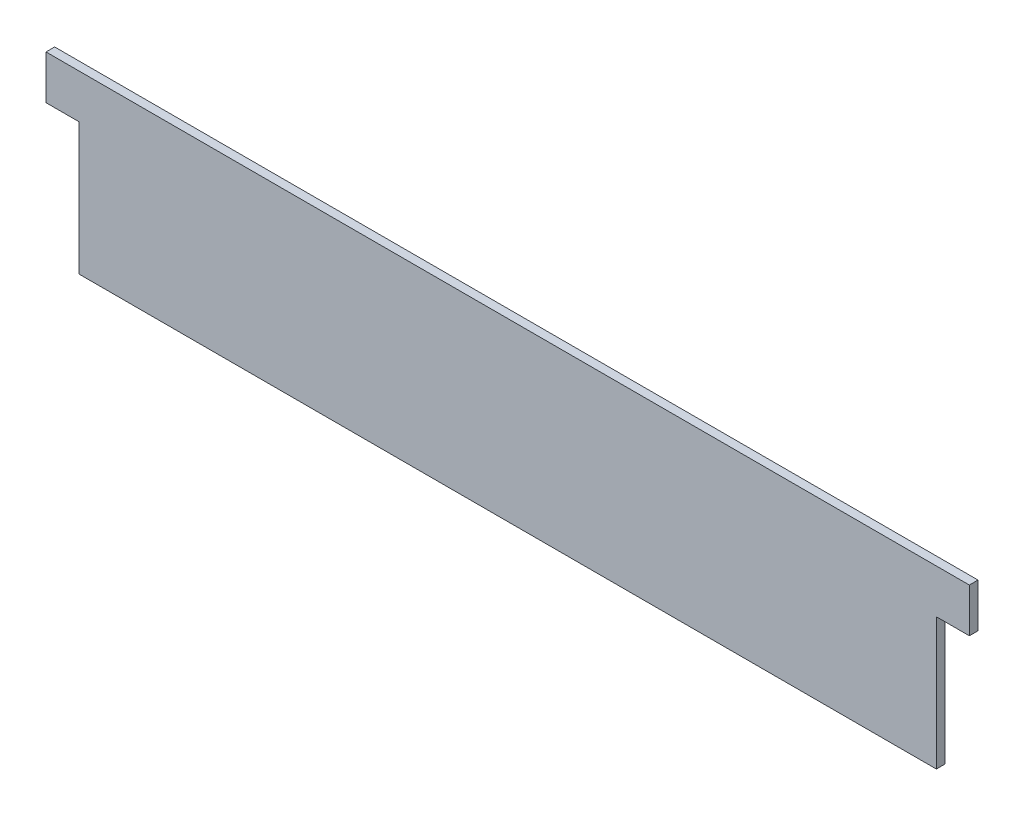
ISO-10303-21;
HEADER;
FILE_DESCRIPTION(('STEP AP214'),'2;1');
FILE_NAME('part.step','',(''),(''),'','','');
FILE_SCHEMA(('AUTOMOTIVE_DESIGN { 1 0 10303 214 1 1 1 1 }'));
ENDSEC;
DATA;
#1=APPLICATION_CONTEXT('core data for automotive mechanical design processes');
#2=APPLICATION_PROTOCOL_DEFINITION('international standard','automotive_design',2000,#1);
#3=PRODUCT_CONTEXT('',#1,'mechanical');
#4=PRODUCT('Part','Part','',(#3));
#5=PRODUCT_RELATED_PRODUCT_CATEGORY('part','',(#4));
#6=PRODUCT_DEFINITION_FORMATION('','',#4);
#7=PRODUCT_DEFINITION_CONTEXT('part definition',#1,'design');
#8=PRODUCT_DEFINITION('design','',#6,#7);
#9=PRODUCT_DEFINITION_SHAPE('','',#8);
#10=(LENGTH_UNIT() NAMED_UNIT(*) SI_UNIT(.MILLI.,.METRE.));
#11=(NAMED_UNIT(*) PLANE_ANGLE_UNIT() SI_UNIT($,.RADIAN.));
#12=(NAMED_UNIT(*) SI_UNIT($,.STERADIAN.) SOLID_ANGLE_UNIT());
#13=UNCERTAINTY_MEASURE_WITH_UNIT(LENGTH_MEASURE(1.E-05),#10,'distance_accuracy_value','');
#14=(GEOMETRIC_REPRESENTATION_CONTEXT(3) GLOBAL_UNCERTAINTY_ASSIGNED_CONTEXT((#13)) GLOBAL_UNIT_ASSIGNED_CONTEXT((#10,
#11,#12)) REPRESENTATION_CONTEXT('',''));
#15=CARTESIAN_POINT('',(0.,0.,0.));
#16=DIRECTION('',(0.,0.,1.));
#17=DIRECTION('',(1.,0.,0.));
#18=AXIS2_PLACEMENT_3D('',#15,#16,#17);
#19=CARTESIAN_POINT('',(-266.7,38.1000000000001,2.5));
#20=DIRECTION('',(1.,0.,0.));
#21=DIRECTION('',(0.,0.,-1.));
#22=AXIS2_PLACEMENT_3D('',#19,#20,#21);
#23=PLANE('',#22);
#24=DIRECTION('',(0.,-1.,0.));
#25=VECTOR('',#24,1.);
#26=CARTESIAN_POINT('',(-266.7,38.1000000000001,-2.5));
#27=LINE('',#26,#25);
#28=CARTESIAN_POINT('',(-266.7,63.5000000000001,-2.5));
#29=VERTEX_POINT('',#28);
#30=CARTESIAN_POINT('',(-266.7,38.1000000000001,-2.5));
#31=VERTEX_POINT('',#30);
#32=EDGE_CURVE('E129',#29,#31,#27,.T.);
#33=ORIENTED_EDGE('',*,*,#32,.T.);
#34=DIRECTION('',(0.,0.,-1.));
#35=VECTOR('',#34,1.);
#36=CARTESIAN_POINT('',(-266.7,38.1000000000001,2.5));
#37=LINE('',#36,#35);
#38=CARTESIAN_POINT('',(-266.7,38.1000000000001,2.5));
#39=VERTEX_POINT('',#38);
#40=EDGE_CURVE('E11',#39,#31,#37,.T.);
#41=ORIENTED_EDGE('',*,*,#40,.F.);
#42=DIRECTION('',(0.,-1.,0.));
#43=VECTOR('',#42,1.);
#44=CARTESIAN_POINT('',(-266.7,38.1000000000001,2.5));
#45=LINE('',#44,#43);
#46=CARTESIAN_POINT('',(-266.7,63.5000000000001,2.5));
#47=VERTEX_POINT('',#46);
#48=EDGE_CURVE('E143',#47,#39,#45,.T.);
#49=ORIENTED_EDGE('',*,*,#48,.F.);
#50=DIRECTION('',(0.,0.,-1.));
#51=VECTOR('',#50,1.);
#52=CARTESIAN_POINT('',(-266.7,63.5000000000001,2.5));
#53=LINE('',#52,#51);
#54=EDGE_CURVE('E125',#47,#29,#53,.T.);
#55=ORIENTED_EDGE('',*,*,#54,.T.);
#56=EDGE_LOOP('',(#33,#41,#49,#55));
#57=FACE_BOUND('',#56,.T.);
#58=ADVANCED_FACE('F33',(#57),#23,.F.);
#59=CARTESIAN_POINT('',(-247.65,38.1,2.5));
#60=DIRECTION('',(0.,1.,0.));
#61=DIRECTION('',(-1.,0.,0.));
#62=AXIS2_PLACEMENT_3D('',#59,#60,#61);
#63=PLANE('',#62);
#64=DIRECTION('',(1.,0.,0.));
#65=VECTOR('',#64,1.);
#66=CARTESIAN_POINT('',(-247.65,38.1,-2.5));
#67=LINE('',#66,#65);
#68=CARTESIAN_POINT('',(-247.65,38.1,-2.5));
#69=VERTEX_POINT('',#68);
#70=EDGE_CURVE('E132',#31,#69,#67,.T.);
#71=ORIENTED_EDGE('',*,*,#70,.T.);
#72=DIRECTION('',(0.,0.,-1.));
#73=VECTOR('',#72,1.);
#74=CARTESIAN_POINT('',(-247.65,38.1,2.5));
#75=LINE('',#74,#73);
#76=CARTESIAN_POINT('',(-247.65,38.1,2.5));
#77=VERTEX_POINT('',#76);
#78=EDGE_CURVE('E41',#77,#69,#75,.T.);
#79=ORIENTED_EDGE('',*,*,#78,.F.);
#80=DIRECTION('',(1.,0.,0.));
#81=VECTOR('',#80,1.);
#82=CARTESIAN_POINT('',(-247.65,38.1,2.5));
#83=LINE('',#82,#81);
#84=EDGE_CURVE('E92',#39,#77,#83,.T.);
#85=ORIENTED_EDGE('',*,*,#84,.F.);
#86=ORIENTED_EDGE('',*,*,#40,.T.);
#87=EDGE_LOOP('',(#71,#79,#85,#86));
#88=FACE_BOUND('',#87,.T.);
#89=ADVANCED_FACE('F178',(#88),#63,.F.);
#90=CARTESIAN_POINT('',(-247.65,-38.1,2.5));
#91=DIRECTION('',(1.,0.,0.));
#92=DIRECTION('',(0.,0.,-1.));
#93=AXIS2_PLACEMENT_3D('',#90,#91,#92);
#94=PLANE('',#93);
#95=DIRECTION('',(0.,-1.,0.));
#96=VECTOR('',#95,1.);
#97=CARTESIAN_POINT('',(-247.65,-38.1,-2.5));
#98=LINE('',#97,#96);
#99=CARTESIAN_POINT('',(-247.65,-38.1,-2.5));
#100=VERTEX_POINT('',#99);
#101=EDGE_CURVE('E134',#69,#100,#98,.T.);
#102=ORIENTED_EDGE('',*,*,#101,.T.);
#103=DIRECTION('',(0.,0.,-1.));
#104=VECTOR('',#103,1.);
#105=CARTESIAN_POINT('',(-247.65,-38.1,2.5));
#106=LINE('',#105,#104);
#107=CARTESIAN_POINT('',(-247.65,-38.1,2.5));
#108=VERTEX_POINT('',#107);
#109=EDGE_CURVE('E150',#108,#100,#106,.T.);
#110=ORIENTED_EDGE('',*,*,#109,.F.);
#111=DIRECTION('',(0.,-1.,0.));
#112=VECTOR('',#111,1.);
#113=CARTESIAN_POINT('',(-247.65,-38.1,2.5));
#114=LINE('',#113,#112);
#115=EDGE_CURVE('E158',#77,#108,#114,.T.);
#116=ORIENTED_EDGE('',*,*,#115,.F.);
#117=ORIENTED_EDGE('',*,*,#78,.T.);
#118=EDGE_LOOP('',(#102,#110,#116,#117));
#119=FACE_BOUND('',#118,.T.);
#120=ADVANCED_FACE('F156',(#119),#94,.F.);
#121=CARTESIAN_POINT('',(247.65,-38.1,2.5));
#122=DIRECTION('',(0.,1.,0.));
#123=DIRECTION('',(0.,0.,1.));
#124=AXIS2_PLACEMENT_3D('',#121,#122,#123);
#125=PLANE('',#124);
#126=DIRECTION('',(1.,0.,0.));
#127=VECTOR('',#126,1.);
#128=CARTESIAN_POINT('',(247.65,-38.1,-2.5));
#129=LINE('',#128,#127);
#130=CARTESIAN_POINT('',(247.65,-38.1,-2.5));
#131=VERTEX_POINT('',#130);
#132=EDGE_CURVE('E136',#100,#131,#129,.T.);
#133=ORIENTED_EDGE('',*,*,#132,.T.);
#134=DIRECTION('',(0.,0.,-1.));
#135=VECTOR('',#134,1.);
#136=CARTESIAN_POINT('',(247.65,-38.1,2.5));
#137=LINE('',#136,#135);
#138=CARTESIAN_POINT('',(247.65,-38.1,2.5));
#139=VERTEX_POINT('',#138);
#140=EDGE_CURVE('E147',#139,#131,#137,.T.);
#141=ORIENTED_EDGE('',*,*,#140,.F.);
#142=DIRECTION('',(1.,0.,0.));
#143=VECTOR('',#142,1.);
#144=CARTESIAN_POINT('',(247.65,-38.1,2.5));
#145=LINE('',#144,#143);
#146=EDGE_CURVE('E170',#108,#139,#145,.T.);
#147=ORIENTED_EDGE('',*,*,#146,.F.);
#148=ORIENTED_EDGE('',*,*,#109,.T.);
#149=EDGE_LOOP('',(#133,#141,#147,#148));
#150=FACE_BOUND('',#149,.T.);
#151=ADVANCED_FACE('F166',(#150),#125,.F.);
#152=CARTESIAN_POINT('',(247.65,38.1,2.5));
#153=DIRECTION('',(-1.,0.,0.));
#154=DIRECTION('',(0.,0.,1.));
#155=AXIS2_PLACEMENT_3D('',#152,#153,#154);
#156=PLANE('',#155);
#157=DIRECTION('',(0.,1.,0.));
#158=VECTOR('',#157,1.);
#159=CARTESIAN_POINT('',(247.65,38.1,-2.5));
#160=LINE('',#159,#158);
#161=CARTESIAN_POINT('',(247.65,38.1,-2.5));
#162=VERTEX_POINT('',#161);
#163=EDGE_CURVE('E138',#131,#162,#160,.T.);
#164=ORIENTED_EDGE('',*,*,#163,.T.);
#165=DIRECTION('',(0.,0.,-1.));
#166=VECTOR('',#165,1.);
#167=CARTESIAN_POINT('',(247.65,38.1,2.5));
#168=LINE('',#167,#166);
#169=CARTESIAN_POINT('',(247.65,38.1,2.5));
#170=VERTEX_POINT('',#169);
#171=EDGE_CURVE('E120',#170,#162,#168,.T.);
#172=ORIENTED_EDGE('',*,*,#171,.F.);
#173=DIRECTION('',(0.,1.,0.));
#174=VECTOR('',#173,1.);
#175=CARTESIAN_POINT('',(247.65,38.1,2.5));
#176=LINE('',#175,#174);
#177=EDGE_CURVE('E111',#139,#170,#176,.T.);
#178=ORIENTED_EDGE('',*,*,#177,.F.);
#179=ORIENTED_EDGE('',*,*,#140,.T.);
#180=EDGE_LOOP('',(#164,#172,#178,#179));
#181=FACE_BOUND('',#180,.T.);
#182=ADVANCED_FACE('F169',(#181),#156,.F.);
#183=CARTESIAN_POINT('',(266.7,38.1000000000001,2.5));
#184=DIRECTION('',(0.,1.,0.));
#185=DIRECTION('',(-1.,0.,0.));
#186=AXIS2_PLACEMENT_3D('',#183,#184,#185);
#187=PLANE('',#186);
#188=DIRECTION('',(1.,0.,0.));
#189=VECTOR('',#188,1.);
#190=CARTESIAN_POINT('',(266.7,38.1000000000001,-2.5));
#191=LINE('',#190,#189);
#192=CARTESIAN_POINT('',(266.7,38.1000000000001,-2.5));
#193=VERTEX_POINT('',#192);
#194=EDGE_CURVE('E119',#162,#193,#191,.T.);
#195=ORIENTED_EDGE('',*,*,#194,.T.);
#196=DIRECTION('',(0.,0.,-1.));
#197=VECTOR('',#196,1.);
#198=CARTESIAN_POINT('',(266.7,38.1000000000001,2.5));
#199=LINE('',#198,#197);
#200=CARTESIAN_POINT('',(266.7,38.1000000000001,2.5));
#201=VERTEX_POINT('',#200);
#202=EDGE_CURVE('E116',#201,#193,#199,.T.);
#203=ORIENTED_EDGE('',*,*,#202,.F.);
#204=DIRECTION('',(1.,0.,0.));
#205=VECTOR('',#204,1.);
#206=CARTESIAN_POINT('',(266.7,38.1000000000001,2.5));
#207=LINE('',#206,#205);
#208=EDGE_CURVE('E105',#170,#201,#207,.T.);
#209=ORIENTED_EDGE('',*,*,#208,.F.);
#210=ORIENTED_EDGE('',*,*,#171,.T.);
#211=EDGE_LOOP('',(#195,#203,#209,#210));
#212=FACE_BOUND('',#211,.T.);
#213=ADVANCED_FACE('F117',(#212),#187,.F.);
#214=CARTESIAN_POINT('',(266.7,63.5000000000001,2.5));
#215=DIRECTION('',(-1.,0.,0.));
#216=DIRECTION('',(0.,0.,1.));
#217=AXIS2_PLACEMENT_3D('',#214,#215,#216);
#218=PLANE('',#217);
#219=DIRECTION('',(0.,1.,0.));
#220=VECTOR('',#219,1.);
#221=CARTESIAN_POINT('',(266.7,63.5000000000001,-2.5));
#222=LINE('',#221,#220);
#223=CARTESIAN_POINT('',(266.7,63.5000000000001,-2.5));
#224=VERTEX_POINT('',#223);
#225=EDGE_CURVE('E78',#193,#224,#222,.T.);
#226=ORIENTED_EDGE('',*,*,#225,.T.);
#227=DIRECTION('',(0.,0.,-1.));
#228=VECTOR('',#227,1.);
#229=CARTESIAN_POINT('',(266.7,63.5000000000001,2.5));
#230=LINE('',#229,#228);
#231=CARTESIAN_POINT('',(266.7,63.5000000000001,2.5));
#232=VERTEX_POINT('',#231);
#233=EDGE_CURVE('E121',#232,#224,#230,.T.);
#234=ORIENTED_EDGE('',*,*,#233,.F.);
#235=DIRECTION('',(0.,1.,0.));
#236=VECTOR('',#235,1.);
#237=CARTESIAN_POINT('',(266.7,63.5000000000001,2.5));
#238=LINE('',#237,#236);
#239=EDGE_CURVE('E109',#201,#232,#238,.T.);
#240=ORIENTED_EDGE('',*,*,#239,.F.);
#241=ORIENTED_EDGE('',*,*,#202,.T.);
#242=EDGE_LOOP('',(#226,#234,#240,#241));
#243=FACE_BOUND('',#242,.T.);
#244=ADVANCED_FACE('F123',(#243),#218,.F.);
#245=CARTESIAN_POINT('',(-266.7,63.5000000000001,2.5));
#246=DIRECTION('',(0.,-1.,0.));
#247=DIRECTION('',(0.,0.,-1.));
#248=AXIS2_PLACEMENT_3D('',#245,#246,#247);
#249=PLANE('',#248);
#250=DIRECTION('',(-1.,0.,0.));
#251=VECTOR('',#250,1.);
#252=CARTESIAN_POINT('',(-266.7,63.5000000000001,-2.5));
#253=LINE('',#252,#251);
#254=EDGE_CURVE('E84',#224,#29,#253,.T.);
#255=ORIENTED_EDGE('',*,*,#254,.T.);
#256=ORIENTED_EDGE('',*,*,#54,.F.);
#257=DIRECTION('',(-1.,0.,0.));
#258=VECTOR('',#257,1.);
#259=CARTESIAN_POINT('',(-266.7,63.5000000000001,2.5));
#260=LINE('',#259,#258);
#261=EDGE_CURVE('E49',#232,#47,#260,.T.);
#262=ORIENTED_EDGE('',*,*,#261,.F.);
#263=ORIENTED_EDGE('',*,*,#233,.T.);
#264=EDGE_LOOP('',(#255,#256,#262,#263));
#265=FACE_BOUND('',#264,.T.);
#266=ADVANCED_FACE('F194',(#265),#249,.F.);
#267=CARTESIAN_POINT('',(0.,0.,2.5));
#268=DIRECTION('',(0.,0.,-1.));
#269=DIRECTION('',(-1.,0.,0.));
#270=AXIS2_PLACEMENT_3D('',#267,#268,#269);
#271=PLANE('',#270);
#272=ORIENTED_EDGE('',*,*,#48,.T.);
#273=ORIENTED_EDGE('',*,*,#84,.T.);
#274=ORIENTED_EDGE('',*,*,#115,.T.);
#275=ORIENTED_EDGE('',*,*,#146,.T.);
#276=ORIENTED_EDGE('',*,*,#177,.T.);
#277=ORIENTED_EDGE('',*,*,#208,.T.);
#278=ORIENTED_EDGE('',*,*,#239,.T.);
#279=ORIENTED_EDGE('',*,*,#261,.T.);
#280=EDGE_LOOP('',(#272,#273,#274,#275,#276,#277,#278,#279));
#281=FACE_BOUND('',#280,.T.);
#282=ADVANCED_FACE('F107',(#281),#271,.F.);
#283=CARTESIAN_POINT('',(0.,0.,-2.5));
#284=DIRECTION('',(0.,0.,-1.));
#285=DIRECTION('',(-1.,0.,0.));
#286=AXIS2_PLACEMENT_3D('',#283,#284,#285);
#287=PLANE('',#286);
#288=ORIENTED_EDGE('',*,*,#32,.F.);
#289=ORIENTED_EDGE('',*,*,#254,.F.);
#290=ORIENTED_EDGE('',*,*,#225,.F.);
#291=ORIENTED_EDGE('',*,*,#194,.F.);
#292=ORIENTED_EDGE('',*,*,#163,.F.);
#293=ORIENTED_EDGE('',*,*,#132,.F.);
#294=ORIENTED_EDGE('',*,*,#101,.F.);
#295=ORIENTED_EDGE('',*,*,#70,.F.);
#296=EDGE_LOOP('',(#288,#289,#290,#291,#292,#293,#294,#295));
#297=FACE_BOUND('',#296,.T.);
#298=ADVANCED_FACE('F162',(#297),#287,.T.);
#299=CLOSED_SHELL('',(#58,#89,#120,#151,#182,#213,#244,#266,#282,#298));
#300=MANIFOLD_SOLID_BREP('B2',#299);
#301=ADVANCED_BREP_SHAPE_REPRESENTATION('',(#18,#300),#14);
#302=SHAPE_DEFINITION_REPRESENTATION(#9,#301);
ENDSEC;
END-ISO-10303-21;
